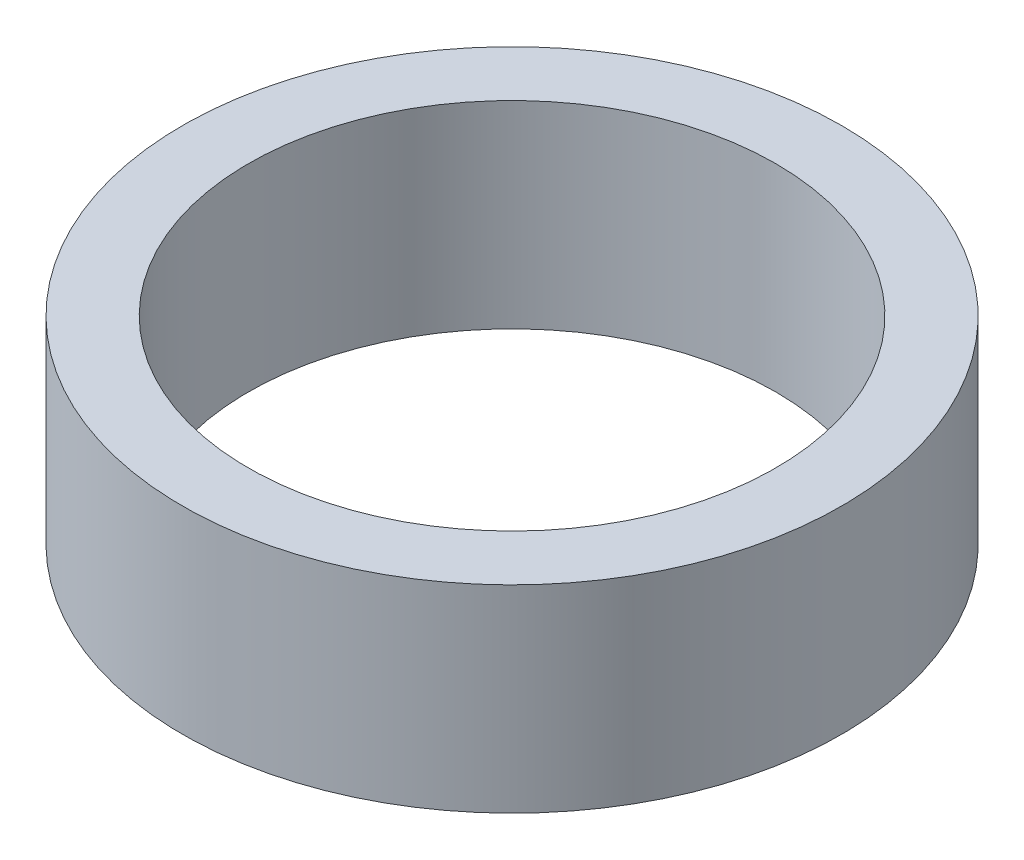
ISO-10303-21;
HEADER;
FILE_DESCRIPTION(('STEP AP214'),'2;1');
FILE_NAME('part.step','',(''),(''),'','','');
FILE_SCHEMA(('AUTOMOTIVE_DESIGN { 1 0 10303 214 1 1 1 1 }'));
ENDSEC;
DATA;
#1=APPLICATION_CONTEXT('core data for automotive mechanical design processes');
#2=APPLICATION_PROTOCOL_DEFINITION('international standard','automotive_design',2000,#1);
#3=PRODUCT_CONTEXT('',#1,'mechanical');
#4=PRODUCT('Part','Part','',(#3));
#5=PRODUCT_RELATED_PRODUCT_CATEGORY('part','',(#4));
#6=PRODUCT_DEFINITION_FORMATION('','',#4);
#7=PRODUCT_DEFINITION_CONTEXT('part definition',#1,'design');
#8=PRODUCT_DEFINITION('design','',#6,#7);
#9=PRODUCT_DEFINITION_SHAPE('','',#8);
#10=(LENGTH_UNIT() NAMED_UNIT(*) SI_UNIT(.MILLI.,.METRE.));
#11=(NAMED_UNIT(*) PLANE_ANGLE_UNIT() SI_UNIT($,.RADIAN.));
#12=(NAMED_UNIT(*) SI_UNIT($,.STERADIAN.) SOLID_ANGLE_UNIT());
#13=UNCERTAINTY_MEASURE_WITH_UNIT(LENGTH_MEASURE(1.E-05),#10,'distance_accuracy_value','');
#14=(GEOMETRIC_REPRESENTATION_CONTEXT(3) GLOBAL_UNCERTAINTY_ASSIGNED_CONTEXT((#13)) GLOBAL_UNIT_ASSIGNED_CONTEXT((#10,
#11,#12)) REPRESENTATION_CONTEXT('',''));
#15=CARTESIAN_POINT('',(0.,0.,0.));
#16=DIRECTION('',(0.,0.,1.));
#17=DIRECTION('',(1.,0.,0.));
#18=AXIS2_PLACEMENT_3D('',#15,#16,#17);
#19=CARTESIAN_POINT('',(0.,9.525,0.));
#20=DIRECTION('',(0.,1.,0.));
#21=DIRECTION('',(0.,0.,1.));
#22=AXIS2_PLACEMENT_3D('',#19,#20,#21);
#23=PLANE('',#22);
#24=CARTESIAN_POINT('',(0.,9.525,0.));
#25=DIRECTION('',(0.,1.,0.));
#26=DIRECTION('',(0.,0.,1.));
#27=AXIS2_PLACEMENT_3D('',#24,#25,#26);
#28=CIRCLE('',#27,15.875);
#29=CARTESIAN_POINT('',(0.,9.525,-15.875));
#30=VERTEX_POINT('',#29);
#31=EDGE_CURVE('E10',#30,#30,#28,.T.);
#32=ORIENTED_EDGE('',*,*,#31,.T.);
#33=EDGE_LOOP('',(#32));
#34=FACE_BOUND('',#33,.T.);
#35=CARTESIAN_POINT('',(0.,9.525,0.));
#36=DIRECTION('',(0.,1.,0.));
#37=DIRECTION('',(0.,0.,1.));
#38=AXIS2_PLACEMENT_3D('',#35,#36,#37);
#39=CIRCLE('',#38,12.7);
#40=CARTESIAN_POINT('',(0.,9.525,-12.7));
#41=VERTEX_POINT('',#40);
#42=EDGE_CURVE('E42',#41,#41,#39,.T.);
#43=ORIENTED_EDGE('',*,*,#42,.F.);
#44=EDGE_LOOP('',(#43));
#45=FACE_BOUND('',#44,.T.);
#46=ADVANCED_FACE('F31',(#34,#45),#23,.T.);
#47=CARTESIAN_POINT('',(0.,0.,0.));
#48=DIRECTION('',(0.,1.,0.));
#49=DIRECTION('',(0.,0.,1.));
#50=AXIS2_PLACEMENT_3D('',#47,#48,#49);
#51=PLANE('',#50);
#52=CARTESIAN_POINT('',(0.,0.,0.));
#53=DIRECTION('',(0.,1.,0.));
#54=DIRECTION('',(0.,0.,1.));
#55=AXIS2_PLACEMENT_3D('',#52,#53,#54);
#56=CIRCLE('',#55,15.875);
#57=CARTESIAN_POINT('',(0.,0.,-15.875));
#58=VERTEX_POINT('',#57);
#59=EDGE_CURVE('E35',#58,#58,#56,.T.);
#60=ORIENTED_EDGE('',*,*,#59,.F.);
#61=EDGE_LOOP('',(#60));
#62=FACE_BOUND('',#61,.T.);
#63=CARTESIAN_POINT('',(0.,0.,0.));
#64=DIRECTION('',(0.,1.,0.));
#65=DIRECTION('',(0.,0.,1.));
#66=AXIS2_PLACEMENT_3D('',#63,#64,#65);
#67=CIRCLE('',#66,12.7);
#68=CARTESIAN_POINT('',(0.,0.,-12.7));
#69=VERTEX_POINT('',#68);
#70=EDGE_CURVE('E44',#69,#69,#67,.T.);
#71=ORIENTED_EDGE('',*,*,#70,.T.);
#72=EDGE_LOOP('',(#71));
#73=FACE_BOUND('',#72,.T.);
#74=ADVANCED_FACE('F54',(#62,#73),#51,.F.);
#75=CARTESIAN_POINT('',(0.,9.525,0.));
#76=DIRECTION('',(0.,-1.,0.));
#77=DIRECTION('',(0.,0.,-1.));
#78=AXIS2_PLACEMENT_3D('',#75,#76,#77);
#79=CYLINDRICAL_SURFACE('',#78,15.875);
#80=CARTESIAN_POINT('',(0.,9.525,-15.875));
#81=CARTESIAN_POINT('',(0.,9.42578125,-15.875));
#82=CARTESIAN_POINT('',(0.,9.3265625,-15.875));
#83=CARTESIAN_POINT('',(0.,9.128125,-15.875));
#84=CARTESIAN_POINT('',(0.,9.02890625,-15.875));
#85=CARTESIAN_POINT('',(0.,8.83046875,-15.875));
#86=CARTESIAN_POINT('',(0.,8.73125,-15.875));
#87=CARTESIAN_POINT('',(0.,8.5328125,-15.875));
#88=CARTESIAN_POINT('',(0.,8.43359375,-15.875));
#89=CARTESIAN_POINT('',(0.,8.23515625,-15.875));
#90=CARTESIAN_POINT('',(0.,8.1359375,-15.875));
#91=CARTESIAN_POINT('',(0.,7.9375,-15.875));
#92=CARTESIAN_POINT('',(0.,7.83828125,-15.875));
#93=CARTESIAN_POINT('',(0.,7.63984375,-15.875));
#94=CARTESIAN_POINT('',(0.,7.540625,-15.875));
#95=CARTESIAN_POINT('',(0.,7.3421875,-15.875));
#96=CARTESIAN_POINT('',(0.,7.24296875,-15.875));
#97=CARTESIAN_POINT('',(0.,7.04453125,-15.875));
#98=CARTESIAN_POINT('',(0.,6.9453125,-15.875));
#99=CARTESIAN_POINT('',(0.,6.746875,-15.875));
#100=CARTESIAN_POINT('',(0.,6.64765625,-15.875));
#101=CARTESIAN_POINT('',(0.,6.44921875,-15.875));
#102=CARTESIAN_POINT('',(0.,6.35,-15.875));
#103=CARTESIAN_POINT('',(0.,6.1515625,-15.875));
#104=CARTESIAN_POINT('',(0.,6.05234375,-15.875));
#105=CARTESIAN_POINT('',(0.,5.85390625,-15.875));
#106=CARTESIAN_POINT('',(0.,5.7546875,-15.875));
#107=CARTESIAN_POINT('',(0.,5.55625,-15.875));
#108=CARTESIAN_POINT('',(0.,5.45703125,-15.875));
#109=CARTESIAN_POINT('',(0.,5.25859375,-15.875));
#110=CARTESIAN_POINT('',(0.,5.159375,-15.875));
#111=CARTESIAN_POINT('',(0.,4.9609375,-15.875));
#112=CARTESIAN_POINT('',(0.,4.86171875,-15.875));
#113=CARTESIAN_POINT('',(0.,4.66328125,-15.875));
#114=CARTESIAN_POINT('',(0.,4.5640625,-15.875));
#115=CARTESIAN_POINT('',(0.,4.365625,-15.875));
#116=CARTESIAN_POINT('',(0.,4.26640625,-15.875));
#117=CARTESIAN_POINT('',(0.,4.06796875,-15.875));
#118=CARTESIAN_POINT('',(0.,3.96875,-15.875));
#119=CARTESIAN_POINT('',(0.,3.7703125,-15.875));
#120=CARTESIAN_POINT('',(0.,3.67109375,-15.875));
#121=CARTESIAN_POINT('',(0.,3.47265625,-15.875));
#122=CARTESIAN_POINT('',(0.,3.3734375,-15.875));
#123=CARTESIAN_POINT('',(0.,3.175,-15.875));
#124=CARTESIAN_POINT('',(0.,3.07578125,-15.875));
#125=CARTESIAN_POINT('',(0.,2.87734375,-15.875));
#126=CARTESIAN_POINT('',(0.,2.778125,-15.875));
#127=CARTESIAN_POINT('',(0.,2.5796875,-15.875));
#128=CARTESIAN_POINT('',(0.,2.48046875,-15.875));
#129=CARTESIAN_POINT('',(0.,2.28203125,-15.875));
#130=CARTESIAN_POINT('',(0.,2.1828125,-15.875));
#131=CARTESIAN_POINT('',(0.,1.984375,-15.875));
#132=CARTESIAN_POINT('',(0.,1.88515625,-15.875));
#133=CARTESIAN_POINT('',(0.,1.68671875,-15.875));
#134=CARTESIAN_POINT('',(0.,1.5875,-15.875));
#135=CARTESIAN_POINT('',(0.,1.3890625,-15.875));
#136=CARTESIAN_POINT('',(0.,1.28984375,-15.875));
#137=CARTESIAN_POINT('',(0.,1.09140625,-15.875));
#138=CARTESIAN_POINT('',(0.,0.992187500000001,-15.875));
#139=CARTESIAN_POINT('',(0.,0.793750000000001,-15.875));
#140=CARTESIAN_POINT('',(0.,0.69453125,-15.875));
#141=CARTESIAN_POINT('',(0.,0.49609375,-15.875));
#142=CARTESIAN_POINT('',(0.,0.396875,-15.875));
#143=CARTESIAN_POINT('',(0.,0.1984375,-15.875));
#144=CARTESIAN_POINT('',(0.,0.0992187500000001,-15.875));
#145=CARTESIAN_POINT('',(0.,0.,-15.875));
#146=B_SPLINE_CURVE_WITH_KNOTS('',3,(#80,#81,#82,#83,#84,#85,#86,#87,#88,#89,#90,#91,#92,#93,
#94,#95,#96,#97,#98,#99,#100,#101,#102,#103,#104,#105,#106,#107,#108,#109,#110,#111,#112,#113,
#114,#115,#116,#117,#118,#119,#120,#121,#122,#123,#124,#125,#126,#127,#128,#129,#130,#131,#132,
#133,#134,#135,#136,#137,#138,#139,#140,#141,#142,#143,#144,#145),.UNSPECIFIED.,.F.,.F.,(4,2,2,
2,2,2,2,2,2,2,2,2,2,2,2,2,2,2,2,2,2,2,2,2,2,2,2,2,2,2,2,2,4),(0.,0.297656249999998,
0.595312499999999,0.892968749999999,1.190625,1.48828125,1.7859375,2.08359375,2.38125,2.67890625,
2.9765625,3.27421875,3.571875,3.86953125,4.1671875,4.46484375,4.7625,5.06015625,5.3578125,
5.65546875,5.953125,6.25078125,6.5484375,6.84609375,7.14375,7.44140625,7.7390625,8.03671875,
8.334375,8.63203125,8.9296875,9.22734375,9.525),.UNSPECIFIED.);
#147=EDGE_CURVE('BSEAM33',#30,#58,#146,.T.);
#148=ORIENTED_EDGE('',*,*,#31,.F.);
#149=ORIENTED_EDGE('',*,*,#59,.T.);
#150=ORIENTED_EDGE('',*,*,#147,.T.);
#151=ORIENTED_EDGE('',*,*,#147,.F.);
#152=EDGE_LOOP('',(#148,#150,#149,#151));
#153=FACE_BOUND('',#152,.T.);
#154=ADVANCED_FACE('F33',(#153),#79,.T.);
#155=CARTESIAN_POINT('',(0.,9.525,0.));
#156=DIRECTION('',(0.,-1.,0.));
#157=DIRECTION('',(0.,0.,-1.));
#158=AXIS2_PLACEMENT_3D('',#155,#156,#157);
#159=CYLINDRICAL_SURFACE('',#158,12.7);
#160=CARTESIAN_POINT('',(0.,9.525,-12.7));
#161=CARTESIAN_POINT('',(0.,9.42578125,-12.7));
#162=CARTESIAN_POINT('',(0.,9.3265625,-12.7));
#163=CARTESIAN_POINT('',(0.,9.128125,-12.7));
#164=CARTESIAN_POINT('',(0.,9.02890625,-12.7));
#165=CARTESIAN_POINT('',(0.,8.83046875,-12.7));
#166=CARTESIAN_POINT('',(0.,8.73125,-12.7));
#167=CARTESIAN_POINT('',(0.,8.5328125,-12.7));
#168=CARTESIAN_POINT('',(0.,8.43359375,-12.7));
#169=CARTESIAN_POINT('',(0.,8.23515625,-12.7));
#170=CARTESIAN_POINT('',(0.,8.1359375,-12.7));
#171=CARTESIAN_POINT('',(0.,7.9375,-12.7));
#172=CARTESIAN_POINT('',(0.,7.83828125,-12.7));
#173=CARTESIAN_POINT('',(0.,7.63984375,-12.7));
#174=CARTESIAN_POINT('',(0.,7.540625,-12.7));
#175=CARTESIAN_POINT('',(0.,7.3421875,-12.7));
#176=CARTESIAN_POINT('',(0.,7.24296875,-12.7));
#177=CARTESIAN_POINT('',(0.,7.04453125,-12.7));
#178=CARTESIAN_POINT('',(0.,6.9453125,-12.7));
#179=CARTESIAN_POINT('',(0.,6.746875,-12.7));
#180=CARTESIAN_POINT('',(0.,6.64765625,-12.7));
#181=CARTESIAN_POINT('',(0.,6.44921875,-12.7));
#182=CARTESIAN_POINT('',(0.,6.35,-12.7));
#183=CARTESIAN_POINT('',(0.,6.1515625,-12.7));
#184=CARTESIAN_POINT('',(0.,6.05234375,-12.7));
#185=CARTESIAN_POINT('',(0.,5.85390625,-12.7));
#186=CARTESIAN_POINT('',(0.,5.7546875,-12.7));
#187=CARTESIAN_POINT('',(0.,5.55625,-12.7));
#188=CARTESIAN_POINT('',(0.,5.45703125,-12.7));
#189=CARTESIAN_POINT('',(0.,5.25859375,-12.7));
#190=CARTESIAN_POINT('',(0.,5.159375,-12.7));
#191=CARTESIAN_POINT('',(0.,4.9609375,-12.7));
#192=CARTESIAN_POINT('',(0.,4.86171875,-12.7));
#193=CARTESIAN_POINT('',(0.,4.66328125,-12.7));
#194=CARTESIAN_POINT('',(0.,4.5640625,-12.7));
#195=CARTESIAN_POINT('',(0.,4.365625,-12.7));
#196=CARTESIAN_POINT('',(0.,4.26640625,-12.7));
#197=CARTESIAN_POINT('',(0.,4.06796875,-12.7));
#198=CARTESIAN_POINT('',(0.,3.96875,-12.7));
#199=CARTESIAN_POINT('',(0.,3.7703125,-12.7));
#200=CARTESIAN_POINT('',(0.,3.67109375,-12.7));
#201=CARTESIAN_POINT('',(0.,3.47265625,-12.7));
#202=CARTESIAN_POINT('',(0.,3.3734375,-12.7));
#203=CARTESIAN_POINT('',(0.,3.175,-12.7));
#204=CARTESIAN_POINT('',(0.,3.07578125,-12.7));
#205=CARTESIAN_POINT('',(0.,2.87734375,-12.7));
#206=CARTESIAN_POINT('',(0.,2.778125,-12.7));
#207=CARTESIAN_POINT('',(0.,2.5796875,-12.7));
#208=CARTESIAN_POINT('',(0.,2.48046875,-12.7));
#209=CARTESIAN_POINT('',(0.,2.28203125,-12.7));
#210=CARTESIAN_POINT('',(0.,2.1828125,-12.7));
#211=CARTESIAN_POINT('',(0.,1.984375,-12.7));
#212=CARTESIAN_POINT('',(0.,1.88515625,-12.7));
#213=CARTESIAN_POINT('',(0.,1.68671875,-12.7));
#214=CARTESIAN_POINT('',(0.,1.5875,-12.7));
#215=CARTESIAN_POINT('',(0.,1.3890625,-12.7));
#216=CARTESIAN_POINT('',(0.,1.28984375,-12.7));
#217=CARTESIAN_POINT('',(0.,1.09140625,-12.7));
#218=CARTESIAN_POINT('',(0.,0.992187500000001,-12.7));
#219=CARTESIAN_POINT('',(0.,0.793750000000001,-12.7));
#220=CARTESIAN_POINT('',(0.,0.69453125,-12.7));
#221=CARTESIAN_POINT('',(0.,0.49609375,-12.7));
#222=CARTESIAN_POINT('',(0.,0.396875,-12.7));
#223=CARTESIAN_POINT('',(0.,0.1984375,-12.7));
#224=CARTESIAN_POINT('',(0.,0.0992187500000001,-12.7));
#225=CARTESIAN_POINT('',(0.,0.,-12.7));
#226=B_SPLINE_CURVE_WITH_KNOTS('',3,(#160,#161,#162,#163,#164,#165,#166,#167,#168,#169,#170,
#171,#172,#173,#174,#175,#176,#177,#178,#179,#180,#181,#182,#183,#184,#185,#186,#187,#188,#189,
#190,#191,#192,#193,#194,#195,#196,#197,#198,#199,#200,#201,#202,#203,#204,#205,#206,#207,#208,
#209,#210,#211,#212,#213,#214,#215,#216,#217,#218,#219,#220,#221,#222,#223,#224,#225),
.UNSPECIFIED.,.F.,.F.,(4,2,2,2,2,2,2,2,2,2,2,2,2,2,2,2,2,2,2,2,2,2,2,2,2,2,2,2,2,2,2,2,4),(0.,
0.29765625,0.5953125,0.892968750000001,1.190625,1.48828125,1.7859375,2.08359375,2.38125,
2.67890625,2.9765625,3.27421875,3.571875,3.86953125,4.1671875,4.46484375,4.7625,5.06015625,
5.3578125,5.65546875,5.953125,6.25078125,6.5484375,6.84609375,7.14375,7.44140625,7.7390625,
8.03671875,8.334375,8.63203125,8.9296875,9.22734375,9.525),.UNSPECIFIED.);
#227=EDGE_CURVE('BSEAM50',#41,#69,#226,.T.);
#228=ORIENTED_EDGE('',*,*,#42,.T.);
#229=ORIENTED_EDGE('',*,*,#70,.F.);
#230=ORIENTED_EDGE('',*,*,#227,.T.);
#231=ORIENTED_EDGE('',*,*,#227,.F.);
#232=EDGE_LOOP('',(#228,#230,#229,#231));
#233=FACE_BOUND('',#232,.T.);
#234=ADVANCED_FACE('F50',(#233),#159,.F.);
#235=CLOSED_SHELL('',(#46,#74,#154,#234));
#236=MANIFOLD_SOLID_BREP('B2',#235);
#237=ADVANCED_BREP_SHAPE_REPRESENTATION('',(#18,#236),#14);
#238=SHAPE_DEFINITION_REPRESENTATION(#9,#237);
ENDSEC;
END-ISO-10303-21;
